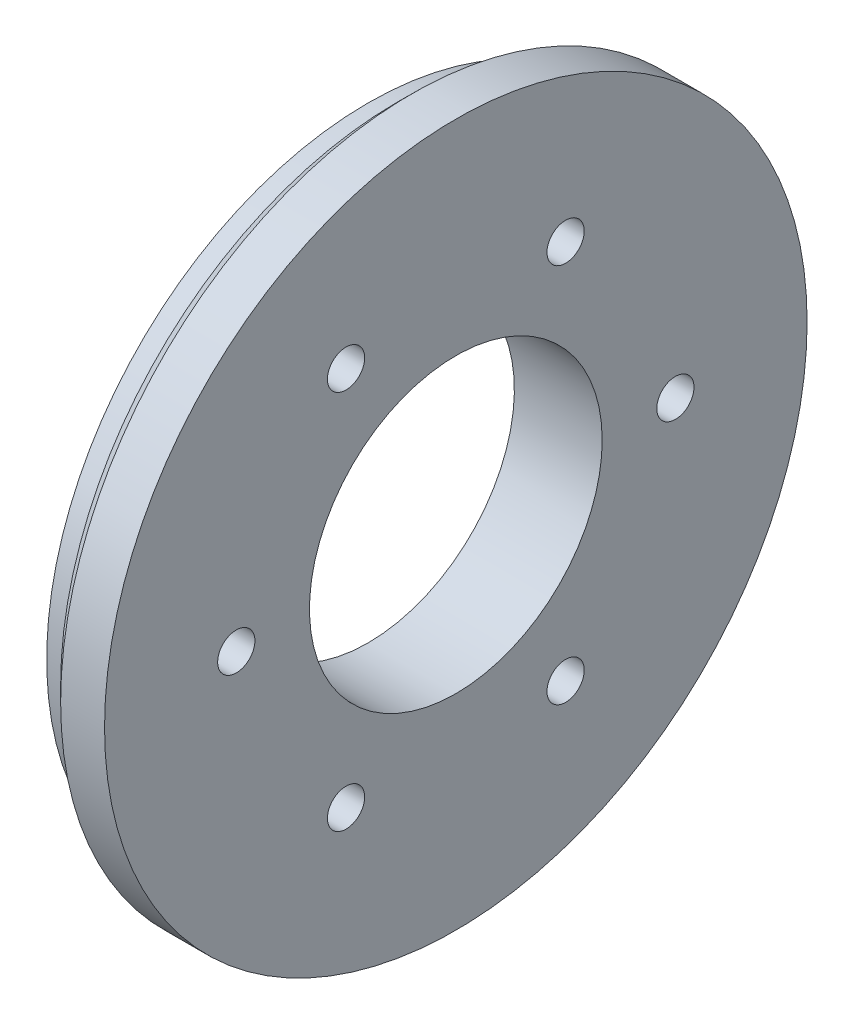
ISO-10303-21;
HEADER;
FILE_DESCRIPTION(('STEP AP214'),'2;1');
FILE_NAME('part.step','',(''),(''),'','','');
FILE_SCHEMA(('AUTOMOTIVE_DESIGN { 1 0 10303 214 1 1 1 1 }'));
ENDSEC;
DATA;
#1=APPLICATION_CONTEXT('core data for automotive mechanical design processes');
#2=APPLICATION_PROTOCOL_DEFINITION('international standard','automotive_design',2000,#1);
#3=PRODUCT_CONTEXT('',#1,'mechanical');
#4=PRODUCT('Part','Part','',(#3));
#5=PRODUCT_RELATED_PRODUCT_CATEGORY('part','',(#4));
#6=PRODUCT_DEFINITION_FORMATION('','',#4);
#7=PRODUCT_DEFINITION_CONTEXT('part definition',#1,'design');
#8=PRODUCT_DEFINITION('design','',#6,#7);
#9=PRODUCT_DEFINITION_SHAPE('','',#8);
#10=(LENGTH_UNIT() NAMED_UNIT(*) SI_UNIT(.MILLI.,.METRE.));
#11=(NAMED_UNIT(*) PLANE_ANGLE_UNIT() SI_UNIT($,.RADIAN.));
#12=(NAMED_UNIT(*) SI_UNIT($,.STERADIAN.) SOLID_ANGLE_UNIT());
#13=UNCERTAINTY_MEASURE_WITH_UNIT(LENGTH_MEASURE(1.E-05),#10,'distance_accuracy_value','');
#14=(GEOMETRIC_REPRESENTATION_CONTEXT(3) GLOBAL_UNCERTAINTY_ASSIGNED_CONTEXT((#13)) GLOBAL_UNIT_ASSIGNED_CONTEXT((#10,
#11,#12)) REPRESENTATION_CONTEXT('',''));
#15=CARTESIAN_POINT('',(0.,0.,0.));
#16=DIRECTION('',(0.,0.,1.));
#17=DIRECTION('',(1.,0.,0.));
#18=AXIS2_PLACEMENT_3D('',#15,#16,#17);
#19=CARTESIAN_POINT('',(3.175,0.,0.));
#20=DIRECTION('',(1.,0.,0.));
#21=DIRECTION('',(0.,0.,-1.));
#22=AXIS2_PLACEMENT_3D('',#19,#20,#21);
#23=PLANE('',#22);
#24=CARTESIAN_POINT('',(3.175,0.,23.8125));
#25=DIRECTION('',(1.,0.,0.));
#26=DIRECTION('',(0.,0.,-1.));
#27=AXIS2_PLACEMENT_3D('',#24,#25,#26);
#28=CIRCLE('',#27,2.0193);
#29=CARTESIAN_POINT('',(3.175,0.,21.7932));
#30=VERTEX_POINT('',#29);
#31=EDGE_CURVE('E76',#30,#30,#28,.T.);
#32=ORIENTED_EDGE('',*,*,#31,.F.);
#33=EDGE_LOOP('',(#32));
#34=FACE_BOUND('',#33,.T.);
#35=CARTESIAN_POINT('',(3.175,-20.622229927617,-11.90625));
#36=DIRECTION('',(1.,0.,0.));
#37=DIRECTION('',(0.,0.,-1.));
#38=AXIS2_PLACEMENT_3D('',#35,#36,#37);
#39=CIRCLE('',#38,2.0193);
#40=CARTESIAN_POINT('',(3.175,-20.622229927617,-13.92555));
#41=VERTEX_POINT('',#40);
#42=EDGE_CURVE('E70',#41,#41,#39,.T.);
#43=ORIENTED_EDGE('',*,*,#42,.F.);
#44=EDGE_LOOP('',(#43));
#45=FACE_BOUND('',#44,.T.);
#46=CARTESIAN_POINT('',(3.175,20.622229927617,-11.90625));
#47=DIRECTION('',(1.,0.,0.));
#48=DIRECTION('',(0.,0.,-1.));
#49=AXIS2_PLACEMENT_3D('',#46,#47,#48);
#50=CIRCLE('',#49,2.0193);
#51=CARTESIAN_POINT('',(3.175,20.622229927617,-13.92555));
#52=VERTEX_POINT('',#51);
#53=EDGE_CURVE('E64',#52,#52,#50,.T.);
#54=ORIENTED_EDGE('',*,*,#53,.F.);
#55=EDGE_LOOP('',(#54));
#56=FACE_BOUND('',#55,.T.);
#57=CARTESIAN_POINT('',(3.175,0.,0.));
#58=DIRECTION('',(1.,0.,0.));
#59=DIRECTION('',(0.,0.,-1.));
#60=AXIS2_PLACEMENT_3D('',#57,#58,#59);
#61=CIRCLE('',#60,38.1);
#62=CARTESIAN_POINT('',(3.175,0.,-38.1));
#63=VERTEX_POINT('',#62);
#64=EDGE_CURVE('E56',#63,#63,#61,.T.);
#65=ORIENTED_EDGE('',*,*,#64,.T.);
#66=EDGE_LOOP('',(#65));
#67=FACE_BOUND('',#66,.T.);
#68=CARTESIAN_POINT('',(3.175,0.,0.));
#69=DIRECTION('',(1.,0.,0.));
#70=DIRECTION('',(0.,0.,-1.));
#71=AXIS2_PLACEMENT_3D('',#68,#69,#70);
#72=CIRCLE('',#71,15.875);
#73=CARTESIAN_POINT('',(3.175,0.,-15.875));
#74=VERTEX_POINT('',#73);
#75=EDGE_CURVE('E61',#74,#74,#72,.T.);
#76=ORIENTED_EDGE('',*,*,#75,.F.);
#77=EDGE_LOOP('',(#76));
#78=FACE_BOUND('',#77,.T.);
#79=CARTESIAN_POINT('',(3.175,0.,-23.8125));
#80=DIRECTION('',(1.,0.,0.));
#81=DIRECTION('',(0.,0.,-1.));
#82=AXIS2_PLACEMENT_3D('',#79,#80,#81);
#83=CIRCLE('',#82,2.0193);
#84=CARTESIAN_POINT('',(3.175,0.,-25.8318));
#85=VERTEX_POINT('',#84);
#86=EDGE_CURVE('E67',#85,#85,#83,.T.);
#87=ORIENTED_EDGE('',*,*,#86,.F.);
#88=EDGE_LOOP('',(#87));
#89=FACE_BOUND('',#88,.T.);
#90=CARTESIAN_POINT('',(3.175,-20.622229927617,11.90625));
#91=DIRECTION('',(1.,0.,0.));
#92=DIRECTION('',(0.,0.,-1.));
#93=AXIS2_PLACEMENT_3D('',#90,#91,#92);
#94=CIRCLE('',#93,2.0193);
#95=CARTESIAN_POINT('',(3.175,-20.622229927617,9.88695000000001));
#96=VERTEX_POINT('',#95);
#97=EDGE_CURVE('E73',#96,#96,#94,.T.);
#98=ORIENTED_EDGE('',*,*,#97,.F.);
#99=EDGE_LOOP('',(#98));
#100=FACE_BOUND('',#99,.T.);
#101=CARTESIAN_POINT('',(3.175,20.622229927617,11.90625));
#102=DIRECTION('',(1.,0.,0.));
#103=DIRECTION('',(0.,0.,-1.));
#104=AXIS2_PLACEMENT_3D('',#101,#102,#103);
#105=CIRCLE('',#104,2.0193);
#106=CARTESIAN_POINT('',(3.175,20.622229927617,9.88695));
#107=VERTEX_POINT('',#106);
#108=EDGE_CURVE('E79',#107,#107,#105,.T.);
#109=ORIENTED_EDGE('',*,*,#108,.F.);
#110=EDGE_LOOP('',(#109));
#111=FACE_BOUND('',#110,.T.);
#112=ADVANCED_FACE('F40',(#34,#45,#56,#67,#78,#89,#100,#111),#23,.T.);
#113=CARTESIAN_POINT('',(-3.175,0.,0.));
#114=DIRECTION('',(1.,0.,0.));
#115=DIRECTION('',(0.,0.,-1.));
#116=AXIS2_PLACEMENT_3D('',#113,#114,#115);
#117=PLANE('',#116);
#118=CARTESIAN_POINT('',(-3.175,0.,0.));
#119=DIRECTION('',(1.,0.,0.));
#120=DIRECTION('',(0.,0.,-1.));
#121=AXIS2_PLACEMENT_3D('',#118,#119,#120);
#122=CIRCLE('',#121,36.5125);
#123=CARTESIAN_POINT('',(-3.175,0.,-36.5125));
#124=VERTEX_POINT('',#123);
#125=EDGE_CURVE('E10',#124,#124,#122,.F.);
#126=ORIENTED_EDGE('',*,*,#125,.T.);
#127=EDGE_LOOP('',(#126));
#128=FACE_BOUND('',#127,.T.);
#129=CARTESIAN_POINT('',(-3.175,0.,0.));
#130=DIRECTION('',(-1.,0.,0.));
#131=DIRECTION('',(0.,-1.,0.));
#132=AXIS2_PLACEMENT_3D('',#129,#130,#131);
#133=CIRCLE('',#132,34.8488);
#134=CARTESIAN_POINT('',(-3.175,-34.8488,0.));
#135=VERTEX_POINT('',#134);
#136=EDGE_CURVE('E52',#135,#135,#133,.T.);
#137=ORIENTED_EDGE('',*,*,#136,.F.);
#138=EDGE_LOOP('',(#137));
#139=FACE_BOUND('',#138,.T.);
#140=ADVANCED_FACE('F127',(#128,#139),#117,.F.);
#141=CARTESIAN_POINT('',(3.175,0.,0.));
#142=DIRECTION('',(-1.,0.,0.));
#143=DIRECTION('',(0.,0.,1.));
#144=AXIS2_PLACEMENT_3D('',#141,#142,#143);
#145=CYLINDRICAL_SURFACE('',#144,38.1);
#146=CARTESIAN_POINT('',(-1.5875,0.,0.));
#147=DIRECTION('',(1.,0.,0.));
#148=DIRECTION('',(0.,0.,-1.));
#149=AXIS2_PLACEMENT_3D('',#146,#147,#148);
#150=CIRCLE('',#149,38.1);
#151=CARTESIAN_POINT('',(-1.5875,0.,-38.1));
#152=VERTEX_POINT('',#151);
#153=EDGE_CURVE('E48',#152,#152,#150,.T.);
#154=ORIENTED_EDGE('',*,*,#153,.T.);
#155=EDGE_LOOP('',(#154));
#156=FACE_BOUND('',#155,.T.);
#157=ORIENTED_EDGE('',*,*,#64,.F.);
#158=EDGE_LOOP('',(#157));
#159=FACE_BOUND('',#158,.T.);
#160=ADVANCED_FACE('F123',(#156,#159),#145,.T.);
#161=CARTESIAN_POINT('',(3.175,0.,0.));
#162=DIRECTION('',(-1.,0.,0.));
#163=DIRECTION('',(0.,0.,1.));
#164=AXIS2_PLACEMENT_3D('',#161,#162,#163);
#165=CYLINDRICAL_SURFACE('',#164,15.875);
#166=ORIENTED_EDGE('',*,*,#75,.T.);
#167=EDGE_LOOP('',(#166));
#168=FACE_BOUND('',#167,.T.);
#169=CARTESIAN_POINT('',(-6.35,0.,0.));
#170=DIRECTION('',(-1.,0.,0.));
#171=DIRECTION('',(0.,-1.,0.));
#172=AXIS2_PLACEMENT_3D('',#169,#170,#171);
#173=CIRCLE('',#172,15.875);
#174=CARTESIAN_POINT('',(-6.35,-15.875,0.));
#175=VERTEX_POINT('',#174);
#176=EDGE_CURVE('E85',#175,#175,#173,.F.);
#177=ORIENTED_EDGE('',*,*,#176,.F.);
#178=EDGE_LOOP('',(#177));
#179=FACE_BOUND('',#178,.T.);
#180=ADVANCED_FACE('F113',(#168,#179),#165,.F.);
#181=CARTESIAN_POINT('',(3.175,20.622229927617,-11.90625));
#182=DIRECTION('',(-1.,0.,0.));
#183=DIRECTION('',(0.,0.,1.));
#184=AXIS2_PLACEMENT_3D('',#181,#182,#183);
#185=CYLINDRICAL_SURFACE('',#184,2.0193);
#186=ORIENTED_EDGE('',*,*,#53,.T.);
#187=EDGE_LOOP('',(#186));
#188=FACE_BOUND('',#187,.T.);
#189=CARTESIAN_POINT('',(-6.35,20.622229927617,-11.90625));
#190=DIRECTION('',(-1.,0.,0.));
#191=DIRECTION('',(0.,-1.,0.));
#192=AXIS2_PLACEMENT_3D('',#189,#190,#191);
#193=CIRCLE('',#192,2.0193);
#194=CARTESIAN_POINT('',(-6.35,18.602929927617,-11.90625));
#195=VERTEX_POINT('',#194);
#196=EDGE_CURVE('E103',#195,#195,#193,.F.);
#197=ORIENTED_EDGE('',*,*,#196,.F.);
#198=EDGE_LOOP('',(#197));
#199=FACE_BOUND('',#198,.T.);
#200=ADVANCED_FACE('F110',(#188,#199),#185,.F.);
#201=CARTESIAN_POINT('',(3.175,0.,-23.8125));
#202=DIRECTION('',(-1.,0.,0.));
#203=DIRECTION('',(0.,0.,1.));
#204=AXIS2_PLACEMENT_3D('',#201,#202,#203);
#205=CYLINDRICAL_SURFACE('',#204,2.0193);
#206=ORIENTED_EDGE('',*,*,#86,.T.);
#207=EDGE_LOOP('',(#206));
#208=FACE_BOUND('',#207,.T.);
#209=CARTESIAN_POINT('',(-6.35,0.,-23.8125));
#210=DIRECTION('',(-1.,0.,0.));
#211=DIRECTION('',(0.,-1.,0.));
#212=AXIS2_PLACEMENT_3D('',#209,#210,#211);
#213=CIRCLE('',#212,2.0193);
#214=CARTESIAN_POINT('',(-6.35,-2.0193,-23.8125));
#215=VERTEX_POINT('',#214);
#216=EDGE_CURVE('E88',#215,#215,#213,.F.);
#217=ORIENTED_EDGE('',*,*,#216,.F.);
#218=EDGE_LOOP('',(#217));
#219=FACE_BOUND('',#218,.T.);
#220=ADVANCED_FACE('F112',(#208,#219),#205,.F.);
#221=CARTESIAN_POINT('',(3.175,-20.622229927617,-11.90625));
#222=DIRECTION('',(-1.,0.,0.));
#223=DIRECTION('',(0.,0.,1.));
#224=AXIS2_PLACEMENT_3D('',#221,#222,#223);
#225=CYLINDRICAL_SURFACE('',#224,2.0193);
#226=ORIENTED_EDGE('',*,*,#42,.T.);
#227=EDGE_LOOP('',(#226));
#228=FACE_BOUND('',#227,.T.);
#229=CARTESIAN_POINT('',(-6.35,-20.622229927617,-11.90625));
#230=DIRECTION('',(-1.,0.,0.));
#231=DIRECTION('',(0.,-1.,0.));
#232=AXIS2_PLACEMENT_3D('',#229,#230,#231);
#233=CIRCLE('',#232,2.0193);
#234=CARTESIAN_POINT('',(-6.35,-22.641529927617,-11.90625));
#235=VERTEX_POINT('',#234);
#236=EDGE_CURVE('E100',#235,#235,#233,.F.);
#237=ORIENTED_EDGE('',*,*,#236,.F.);
#238=EDGE_LOOP('',(#237));
#239=FACE_BOUND('',#238,.T.);
#240=ADVANCED_FACE('F120',(#228,#239),#225,.F.);
#241=CARTESIAN_POINT('',(3.175,-20.622229927617,11.90625));
#242=DIRECTION('',(-1.,0.,0.));
#243=DIRECTION('',(0.,0.,1.));
#244=AXIS2_PLACEMENT_3D('',#241,#242,#243);
#245=CYLINDRICAL_SURFACE('',#244,2.0193);
#246=ORIENTED_EDGE('',*,*,#97,.T.);
#247=EDGE_LOOP('',(#246));
#248=FACE_BOUND('',#247,.T.);
#249=CARTESIAN_POINT('',(-6.35,-20.622229927617,11.90625));
#250=DIRECTION('',(-1.,0.,0.));
#251=DIRECTION('',(0.,-1.,0.));
#252=AXIS2_PLACEMENT_3D('',#249,#250,#251);
#253=CIRCLE('',#252,2.0193);
#254=CARTESIAN_POINT('',(-6.35,-22.641529927617,11.90625));
#255=VERTEX_POINT('',#254);
#256=EDGE_CURVE('E91',#255,#255,#253,.F.);
#257=ORIENTED_EDGE('',*,*,#256,.F.);
#258=EDGE_LOOP('',(#257));
#259=FACE_BOUND('',#258,.T.);
#260=ADVANCED_FACE('F180',(#248,#259),#245,.F.);
#261=CARTESIAN_POINT('',(3.175,0.,23.8125));
#262=DIRECTION('',(-1.,0.,0.));
#263=DIRECTION('',(0.,0.,1.));
#264=AXIS2_PLACEMENT_3D('',#261,#262,#263);
#265=CYLINDRICAL_SURFACE('',#264,2.0193);
#266=ORIENTED_EDGE('',*,*,#31,.T.);
#267=EDGE_LOOP('',(#266));
#268=FACE_BOUND('',#267,.T.);
#269=CARTESIAN_POINT('',(-6.35,0.,23.8125));
#270=DIRECTION('',(-1.,0.,0.));
#271=DIRECTION('',(0.,-1.,0.));
#272=AXIS2_PLACEMENT_3D('',#269,#270,#271);
#273=CIRCLE('',#272,2.0193);
#274=CARTESIAN_POINT('',(-6.35,-2.01930000000001,23.8125));
#275=VERTEX_POINT('',#274);
#276=EDGE_CURVE('E97',#275,#275,#273,.F.);
#277=ORIENTED_EDGE('',*,*,#276,.F.);
#278=EDGE_LOOP('',(#277));
#279=FACE_BOUND('',#278,.T.);
#280=ADVANCED_FACE('F155',(#268,#279),#265,.F.);
#281=CARTESIAN_POINT('',(3.175,20.622229927617,11.90625));
#282=DIRECTION('',(-1.,0.,0.));
#283=DIRECTION('',(0.,0.,1.));
#284=AXIS2_PLACEMENT_3D('',#281,#282,#283);
#285=CYLINDRICAL_SURFACE('',#284,2.0193);
#286=ORIENTED_EDGE('',*,*,#108,.T.);
#287=EDGE_LOOP('',(#286));
#288=FACE_BOUND('',#287,.T.);
#289=CARTESIAN_POINT('',(-6.35,20.622229927617,11.90625));
#290=DIRECTION('',(-1.,0.,0.));
#291=DIRECTION('',(0.,-1.,0.));
#292=AXIS2_PLACEMENT_3D('',#289,#290,#291);
#293=CIRCLE('',#292,2.0193);
#294=CARTESIAN_POINT('',(-6.35,18.602929927617,11.90625));
#295=VERTEX_POINT('',#294);
#296=EDGE_CURVE('E94',#295,#295,#293,.F.);
#297=ORIENTED_EDGE('',*,*,#296,.F.);
#298=EDGE_LOOP('',(#297));
#299=FACE_BOUND('',#298,.T.);
#300=ADVANCED_FACE('F151',(#288,#299),#285,.F.);
#301=CARTESIAN_POINT('',(-6.35,0.,0.));
#302=DIRECTION('',(1.,0.,0.));
#303=DIRECTION('',(0.,1.,0.));
#304=AXIS2_PLACEMENT_3D('',#301,#302,#303);
#305=CYLINDRICAL_SURFACE('',#304,34.8488);
#306=CARTESIAN_POINT('',(-6.35,0.,0.));
#307=DIRECTION('',(-1.,0.,0.));
#308=DIRECTION('',(0.,-1.,0.));
#309=AXIS2_PLACEMENT_3D('',#306,#307,#308);
#310=CIRCLE('',#309,34.8488);
#311=CARTESIAN_POINT('',(-6.35,-34.8488,0.));
#312=VERTEX_POINT('',#311);
#313=EDGE_CURVE('E81',#312,#312,#310,.T.);
#314=ORIENTED_EDGE('',*,*,#313,.F.);
#315=EDGE_LOOP('',(#314));
#316=FACE_BOUND('',#315,.T.);
#317=ORIENTED_EDGE('',*,*,#136,.T.);
#318=EDGE_LOOP('',(#317));
#319=FACE_BOUND('',#318,.T.);
#320=ADVANCED_FACE('F154',(#316,#319),#305,.T.);
#321=CARTESIAN_POINT('',(-6.35,0.,0.));
#322=DIRECTION('',(-1.,0.,0.));
#323=DIRECTION('',(0.,-1.,0.));
#324=AXIS2_PLACEMENT_3D('',#321,#322,#323);
#325=PLANE('',#324);
#326=ORIENTED_EDGE('',*,*,#196,.T.);
#327=EDGE_LOOP('',(#326));
#328=FACE_BOUND('',#327,.T.);
#329=ORIENTED_EDGE('',*,*,#236,.T.);
#330=EDGE_LOOP('',(#329));
#331=FACE_BOUND('',#330,.T.);
#332=ORIENTED_EDGE('',*,*,#276,.T.);
#333=EDGE_LOOP('',(#332));
#334=FACE_BOUND('',#333,.T.);
#335=ORIENTED_EDGE('',*,*,#296,.T.);
#336=EDGE_LOOP('',(#335));
#337=FACE_BOUND('',#336,.T.);
#338=ORIENTED_EDGE('',*,*,#256,.T.);
#339=EDGE_LOOP('',(#338));
#340=FACE_BOUND('',#339,.T.);
#341=ORIENTED_EDGE('',*,*,#216,.T.);
#342=EDGE_LOOP('',(#341));
#343=FACE_BOUND('',#342,.T.);
#344=ORIENTED_EDGE('',*,*,#176,.T.);
#345=EDGE_LOOP('',(#344));
#346=FACE_BOUND('',#345,.T.);
#347=ORIENTED_EDGE('',*,*,#313,.T.);
#348=EDGE_LOOP('',(#347));
#349=FACE_BOUND('',#348,.T.);
#350=ADVANCED_FACE('F107',(#328,#331,#334,#337,#340,#343,#346,#349),#325,.T.);
#351=CARTESIAN_POINT('',(-1.5875,0.,0.));
#352=DIRECTION('',(1.,0.,0.));
#353=DIRECTION('',(0.,0.,-1.));
#354=AXIS2_PLACEMENT_3D('',#351,#352,#353);
#355=CONICAL_SURFACE('',#354,38.1,0.78539816339745);
#356=ORIENTED_EDGE('',*,*,#125,.F.);
#357=EDGE_LOOP('',(#356));
#358=FACE_BOUND('',#357,.T.);
#359=ORIENTED_EDGE('',*,*,#153,.F.);
#360=EDGE_LOOP('',(#359));
#361=FACE_BOUND('',#360,.T.);
#362=ADVANCED_FACE('F43',(#358,#361),#355,.T.);
#363=CLOSED_SHELL('',(#112,#140,#160,#180,#200,#220,#240,#260,#280,#300,#320,#350,#362));
#364=MANIFOLD_SOLID_BREP('B2',#363);
#365=ADVANCED_BREP_SHAPE_REPRESENTATION('',(#18,#364),#14);
#366=SHAPE_DEFINITION_REPRESENTATION(#9,#365);
ENDSEC;
END-ISO-10303-21;
